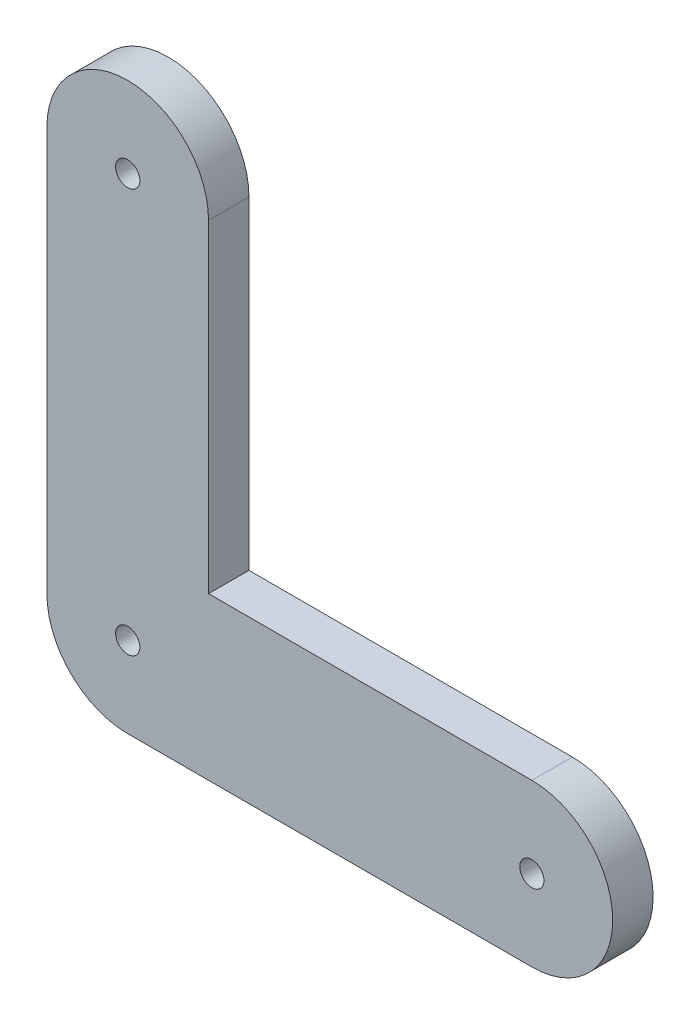
ISO-10303-21;
HEADER;
FILE_DESCRIPTION(('STEP AP214'),'2;1');
FILE_NAME('part.step','',(''),(''),'','','');
FILE_SCHEMA(('AUTOMOTIVE_DESIGN { 1 0 10303 214 1 1 1 1 }'));
ENDSEC;
DATA;
#1=APPLICATION_CONTEXT('core data for automotive mechanical design processes');
#2=APPLICATION_PROTOCOL_DEFINITION('international standard','automotive_design',2000,#1);
#3=PRODUCT_CONTEXT('',#1,'mechanical');
#4=PRODUCT('Part','Part','',(#3));
#5=PRODUCT_RELATED_PRODUCT_CATEGORY('part','',(#4));
#6=PRODUCT_DEFINITION_FORMATION('','',#4);
#7=PRODUCT_DEFINITION_CONTEXT('part definition',#1,'design');
#8=PRODUCT_DEFINITION('design','',#6,#7);
#9=PRODUCT_DEFINITION_SHAPE('','',#8);
#10=(LENGTH_UNIT() NAMED_UNIT(*) SI_UNIT(.MILLI.,.METRE.));
#11=(NAMED_UNIT(*) PLANE_ANGLE_UNIT() SI_UNIT($,.RADIAN.));
#12=(NAMED_UNIT(*) SI_UNIT($,.STERADIAN.) SOLID_ANGLE_UNIT());
#13=UNCERTAINTY_MEASURE_WITH_UNIT(LENGTH_MEASURE(1.E-05),#10,'distance_accuracy_value','');
#14=(GEOMETRIC_REPRESENTATION_CONTEXT(3) GLOBAL_UNCERTAINTY_ASSIGNED_CONTEXT((#13)) GLOBAL_UNIT_ASSIGNED_CONTEXT((#10,
#11,#12)) REPRESENTATION_CONTEXT('',''));
#15=CARTESIAN_POINT('',(0.,0.,0.));
#16=DIRECTION('',(0.,0.,1.));
#17=DIRECTION('',(1.,0.,0.));
#18=AXIS2_PLACEMENT_3D('',#15,#16,#17);
#19=CARTESIAN_POINT('',(50.,0.,5.));
#20=DIRECTION('',(0.,0.,1.));
#21=DIRECTION('',(1.,0.,0.));
#22=AXIS2_PLACEMENT_3D('',#19,#20,#21);
#23=PLANE('',#22);
#24=CARTESIAN_POINT('',(0.,50.,5.));
#25=DIRECTION('',(0.,0.,1.));
#26=DIRECTION('',(1.,0.,0.));
#27=AXIS2_PLACEMENT_3D('',#24,#25,#26);
#28=CIRCLE('',#27,1.5);
#29=CARTESIAN_POINT('',(1.5,50.,5.));
#30=VERTEX_POINT('',#29);
#31=EDGE_CURVE('E192',#30,#30,#28,.T.);
#32=ORIENTED_EDGE('',*,*,#31,.F.);
#33=EDGE_LOOP('',(#32));
#34=FACE_BOUND('',#33,.T.);
#35=DIRECTION('',(0.,1.,0.));
#36=VECTOR('',#35,1.);
#37=CARTESIAN_POINT('',(10.,50.,5.));
#38=LINE('',#37,#36);
#39=CARTESIAN_POINT('',(10.,10.,5.));
#40=VERTEX_POINT('',#39);
#41=CARTESIAN_POINT('',(10.,50.,5.));
#42=VERTEX_POINT('',#41);
#43=EDGE_CURVE('E155',#40,#42,#38,.T.);
#44=ORIENTED_EDGE('',*,*,#43,.T.);
#45=CARTESIAN_POINT('',(0.,50.,5.));
#46=DIRECTION('',(0.,0.,1.));
#47=DIRECTION('',(1.,0.,0.));
#48=AXIS2_PLACEMENT_3D('',#45,#46,#47);
#49=CIRCLE('',#48,10.);
#50=CARTESIAN_POINT('',(-10.,50.,5.));
#51=VERTEX_POINT('',#50);
#52=EDGE_CURVE('E97',#42,#51,#49,.T.);
#53=ORIENTED_EDGE('',*,*,#52,.T.);
#54=DIRECTION('',(0.,-1.,0.));
#55=VECTOR('',#54,1.);
#56=CARTESIAN_POINT('',(-10.,50.,5.));
#57=LINE('',#56,#55);
#58=CARTESIAN_POINT('',(-10.,0.,5.));
#59=VERTEX_POINT('',#58);
#60=EDGE_CURVE('E172',#51,#59,#57,.T.);
#61=ORIENTED_EDGE('',*,*,#60,.T.);
#62=CARTESIAN_POINT('',(0.,0.,5.));
#63=DIRECTION('',(0.,0.,1.));
#64=DIRECTION('',(1.,0.,0.));
#65=AXIS2_PLACEMENT_3D('',#62,#63,#64);
#66=CIRCLE('',#65,10.);
#67=CARTESIAN_POINT('',(0.,-10.,5.));
#68=VERTEX_POINT('',#67);
#69=EDGE_CURVE('E113',#59,#68,#66,.T.);
#70=ORIENTED_EDGE('',*,*,#69,.T.);
#71=DIRECTION('',(1.,0.,0.));
#72=VECTOR('',#71,1.);
#73=CARTESIAN_POINT('',(0.,-10.,5.));
#74=LINE('',#73,#72);
#75=CARTESIAN_POINT('',(50.,-10.,5.));
#76=VERTEX_POINT('',#75);
#77=EDGE_CURVE('E107',#68,#76,#74,.T.);
#78=ORIENTED_EDGE('',*,*,#77,.T.);
#79=CARTESIAN_POINT('',(50.,0.,5.));
#80=DIRECTION('',(0.,0.,1.));
#81=DIRECTION('',(1.,0.,0.));
#82=AXIS2_PLACEMENT_3D('',#79,#80,#81);
#83=CIRCLE('',#82,10.);
#84=CARTESIAN_POINT('',(50.,10.,5.));
#85=VERTEX_POINT('',#84);
#86=EDGE_CURVE('E111',#76,#85,#83,.T.);
#87=ORIENTED_EDGE('',*,*,#86,.T.);
#88=DIRECTION('',(-1.,0.,0.));
#89=VECTOR('',#88,1.);
#90=CARTESIAN_POINT('',(10.,10.,5.));
#91=LINE('',#90,#89);
#92=EDGE_CURVE('E57',#85,#40,#91,.T.);
#93=ORIENTED_EDGE('',*,*,#92,.T.);
#94=EDGE_LOOP('',(#44,#53,#61,#70,#78,#87,#93));
#95=FACE_BOUND('',#94,.T.);
#96=CARTESIAN_POINT('',(0.,0.,5.));
#97=DIRECTION('',(0.,0.,1.));
#98=DIRECTION('',(1.,0.,0.));
#99=AXIS2_PLACEMENT_3D('',#96,#97,#98);
#100=CIRCLE('',#99,1.5);
#101=CARTESIAN_POINT('',(1.5,0.,5.));
#102=VERTEX_POINT('',#101);
#103=EDGE_CURVE('E140',#102,#102,#100,.T.);
#104=ORIENTED_EDGE('',*,*,#103,.F.);
#105=EDGE_LOOP('',(#104));
#106=FACE_BOUND('',#105,.T.);
#107=CARTESIAN_POINT('',(50.,0.,5.));
#108=DIRECTION('',(0.,0.,1.));
#109=DIRECTION('',(1.,0.,0.));
#110=AXIS2_PLACEMENT_3D('',#107,#108,#109);
#111=CIRCLE('',#110,1.5);
#112=CARTESIAN_POINT('',(51.5,0.,5.));
#113=VERTEX_POINT('',#112);
#114=EDGE_CURVE('E200',#113,#113,#111,.T.);
#115=ORIENTED_EDGE('',*,*,#114,.F.);
#116=EDGE_LOOP('',(#115));
#117=FACE_BOUND('',#116,.T.);
#118=ADVANCED_FACE('F39',(#34,#95,#106,#117),#23,.T.);
#119=CARTESIAN_POINT('',(50.,0.,0.));
#120=DIRECTION('',(0.,0.,1.));
#121=DIRECTION('',(1.,0.,0.));
#122=AXIS2_PLACEMENT_3D('',#119,#120,#121);
#123=PLANE('',#122);
#124=DIRECTION('',(0.,1.,0.));
#125=VECTOR('',#124,1.);
#126=CARTESIAN_POINT('',(10.,50.,0.));
#127=LINE('',#126,#125);
#128=CARTESIAN_POINT('',(10.,10.,0.));
#129=VERTEX_POINT('',#128);
#130=CARTESIAN_POINT('',(10.,50.,0.));
#131=VERTEX_POINT('',#130);
#132=EDGE_CURVE('E135',#129,#131,#127,.T.);
#133=ORIENTED_EDGE('',*,*,#132,.F.);
#134=DIRECTION('',(-1.,0.,0.));
#135=VECTOR('',#134,1.);
#136=CARTESIAN_POINT('',(10.,10.,0.));
#137=LINE('',#136,#135);
#138=CARTESIAN_POINT('',(50.,10.,0.));
#139=VERTEX_POINT('',#138);
#140=EDGE_CURVE('E89',#139,#129,#137,.T.);
#141=ORIENTED_EDGE('',*,*,#140,.F.);
#142=CARTESIAN_POINT('',(50.,0.,0.));
#143=DIRECTION('',(0.,0.,1.));
#144=DIRECTION('',(1.,0.,0.));
#145=AXIS2_PLACEMENT_3D('',#142,#143,#144);
#146=CIRCLE('',#145,10.);
#147=CARTESIAN_POINT('',(50.,-10.,0.));
#148=VERTEX_POINT('',#147);
#149=EDGE_CURVE('E83',#148,#139,#146,.T.);
#150=ORIENTED_EDGE('',*,*,#149,.F.);
#151=DIRECTION('',(1.,0.,0.));
#152=VECTOR('',#151,1.);
#153=CARTESIAN_POINT('',(0.,-10.,0.));
#154=LINE('',#153,#152);
#155=CARTESIAN_POINT('',(0.,-10.,0.));
#156=VERTEX_POINT('',#155);
#157=EDGE_CURVE('E122',#156,#148,#154,.T.);
#158=ORIENTED_EDGE('',*,*,#157,.F.);
#159=CARTESIAN_POINT('',(0.,0.,0.));
#160=DIRECTION('',(0.,0.,1.));
#161=DIRECTION('',(1.,0.,0.));
#162=AXIS2_PLACEMENT_3D('',#159,#160,#161);
#163=CIRCLE('',#162,10.);
#164=CARTESIAN_POINT('',(-10.,0.,0.));
#165=VERTEX_POINT('',#164);
#166=EDGE_CURVE('E146',#165,#156,#163,.T.);
#167=ORIENTED_EDGE('',*,*,#166,.F.);
#168=DIRECTION('',(0.,-1.,0.));
#169=VECTOR('',#168,1.);
#170=CARTESIAN_POINT('',(-10.,50.,0.));
#171=LINE('',#170,#169);
#172=CARTESIAN_POINT('',(-10.,50.,0.));
#173=VERTEX_POINT('',#172);
#174=EDGE_CURVE('E143',#173,#165,#171,.T.);
#175=ORIENTED_EDGE('',*,*,#174,.F.);
#176=CARTESIAN_POINT('',(0.,50.,0.));
#177=DIRECTION('',(0.,0.,1.));
#178=DIRECTION('',(1.,0.,0.));
#179=AXIS2_PLACEMENT_3D('',#176,#177,#178);
#180=CIRCLE('',#179,10.);
#181=EDGE_CURVE('E139',#131,#173,#180,.T.);
#182=ORIENTED_EDGE('',*,*,#181,.F.);
#183=EDGE_LOOP('',(#133,#141,#150,#158,#167,#175,#182));
#184=FACE_BOUND('',#183,.T.);
#185=CARTESIAN_POINT('',(0.,0.,0.));
#186=DIRECTION('',(0.,0.,1.));
#187=DIRECTION('',(1.,0.,0.));
#188=AXIS2_PLACEMENT_3D('',#185,#186,#187);
#189=CIRCLE('',#188,1.5);
#190=CARTESIAN_POINT('',(1.5,0.,0.));
#191=VERTEX_POINT('',#190);
#192=EDGE_CURVE('E188',#191,#191,#189,.T.);
#193=ORIENTED_EDGE('',*,*,#192,.T.);
#194=EDGE_LOOP('',(#193));
#195=FACE_BOUND('',#194,.T.);
#196=CARTESIAN_POINT('',(0.,50.,0.));
#197=DIRECTION('',(0.,0.,1.));
#198=DIRECTION('',(1.,0.,0.));
#199=AXIS2_PLACEMENT_3D('',#196,#197,#198);
#200=CIRCLE('',#199,1.5);
#201=CARTESIAN_POINT('',(1.5,50.,0.));
#202=VERTEX_POINT('',#201);
#203=EDGE_CURVE('E196',#202,#202,#200,.T.);
#204=ORIENTED_EDGE('',*,*,#203,.T.);
#205=EDGE_LOOP('',(#204));
#206=FACE_BOUND('',#205,.T.);
#207=CARTESIAN_POINT('',(50.,0.,0.));
#208=DIRECTION('',(0.,0.,1.));
#209=DIRECTION('',(1.,0.,0.));
#210=AXIS2_PLACEMENT_3D('',#207,#208,#209);
#211=CIRCLE('',#210,1.5);
#212=CARTESIAN_POINT('',(51.5,0.,0.));
#213=VERTEX_POINT('',#212);
#214=EDGE_CURVE('E204',#213,#213,#211,.T.);
#215=ORIENTED_EDGE('',*,*,#214,.T.);
#216=EDGE_LOOP('',(#215));
#217=FACE_BOUND('',#216,.T.);
#218=ADVANCED_FACE('F176',(#184,#195,#206,#217),#123,.F.);
#219=CARTESIAN_POINT('',(10.,50.,5.));
#220=DIRECTION('',(-1.,0.,0.));
#221=DIRECTION('',(0.,-1.,0.));
#222=AXIS2_PLACEMENT_3D('',#219,#220,#221);
#223=PLANE('',#222);
#224=ORIENTED_EDGE('',*,*,#132,.T.);
#225=DIRECTION('',(0.,0.,-1.));
#226=VECTOR('',#225,1.);
#227=CARTESIAN_POINT('',(10.,50.,5.));
#228=LINE('',#227,#226);
#229=EDGE_CURVE('E11',#42,#131,#228,.T.);
#230=ORIENTED_EDGE('',*,*,#229,.F.);
#231=ORIENTED_EDGE('',*,*,#43,.F.);
#232=DIRECTION('',(0.,0.,-1.));
#233=VECTOR('',#232,1.);
#234=CARTESIAN_POINT('',(10.,10.,5.));
#235=LINE('',#234,#233);
#236=EDGE_CURVE('E131',#40,#129,#235,.T.);
#237=ORIENTED_EDGE('',*,*,#236,.T.);
#238=EDGE_LOOP('',(#224,#230,#231,#237));
#239=FACE_BOUND('',#238,.T.);
#240=ADVANCED_FACE('F41',(#239),#223,.F.);
#241=CARTESIAN_POINT('',(0.,50.,5.));
#242=DIRECTION('',(0.,0.,-1.));
#243=DIRECTION('',(-1.,0.,0.));
#244=AXIS2_PLACEMENT_3D('',#241,#242,#243);
#245=CYLINDRICAL_SURFACE('',#244,10.);
#246=ORIENTED_EDGE('',*,*,#181,.T.);
#247=DIRECTION('',(0.,0.,-1.));
#248=VECTOR('',#247,1.);
#249=CARTESIAN_POINT('',(-10.,50.,5.));
#250=LINE('',#249,#248);
#251=EDGE_CURVE('E49',#51,#173,#250,.T.);
#252=ORIENTED_EDGE('',*,*,#251,.F.);
#253=ORIENTED_EDGE('',*,*,#52,.F.);
#254=ORIENTED_EDGE('',*,*,#229,.T.);
#255=EDGE_LOOP('',(#246,#252,#253,#254));
#256=FACE_BOUND('',#255,.T.);
#257=ADVANCED_FACE('F237',(#256),#245,.T.);
#258=CARTESIAN_POINT('',(-10.,50.,5.));
#259=DIRECTION('',(1.,0.,0.));
#260=DIRECTION('',(0.,1.,0.));
#261=AXIS2_PLACEMENT_3D('',#258,#259,#260);
#262=PLANE('',#261);
#263=ORIENTED_EDGE('',*,*,#174,.T.);
#264=DIRECTION('',(0.,0.,-1.));
#265=VECTOR('',#264,1.);
#266=CARTESIAN_POINT('',(-10.,0.,5.));
#267=LINE('',#266,#265);
#268=EDGE_CURVE('E162',#59,#165,#267,.T.);
#269=ORIENTED_EDGE('',*,*,#268,.F.);
#270=ORIENTED_EDGE('',*,*,#60,.F.);
#271=ORIENTED_EDGE('',*,*,#251,.T.);
#272=EDGE_LOOP('',(#263,#269,#270,#271));
#273=FACE_BOUND('',#272,.T.);
#274=ADVANCED_FACE('F170',(#273),#262,.F.);
#275=CARTESIAN_POINT('',(0.,0.,5.));
#276=DIRECTION('',(0.,0.,-1.));
#277=DIRECTION('',(-1.,0.,0.));
#278=AXIS2_PLACEMENT_3D('',#275,#276,#277);
#279=CYLINDRICAL_SURFACE('',#278,10.);
#280=ORIENTED_EDGE('',*,*,#166,.T.);
#281=DIRECTION('',(0.,0.,-1.));
#282=VECTOR('',#281,1.);
#283=CARTESIAN_POINT('',(0.,-10.,5.));
#284=LINE('',#283,#282);
#285=EDGE_CURVE('E124',#68,#156,#284,.T.);
#286=ORIENTED_EDGE('',*,*,#285,.F.);
#287=ORIENTED_EDGE('',*,*,#69,.F.);
#288=ORIENTED_EDGE('',*,*,#268,.T.);
#289=EDGE_LOOP('',(#280,#286,#287,#288));
#290=FACE_BOUND('',#289,.T.);
#291=ADVANCED_FACE('F179',(#290),#279,.T.);
#292=CARTESIAN_POINT('',(0.,-10.,5.));
#293=DIRECTION('',(0.,1.,0.));
#294=DIRECTION('',(0.,0.,1.));
#295=AXIS2_PLACEMENT_3D('',#292,#293,#294);
#296=PLANE('',#295);
#297=ORIENTED_EDGE('',*,*,#157,.T.);
#298=DIRECTION('',(0.,0.,-1.));
#299=VECTOR('',#298,1.);
#300=CARTESIAN_POINT('',(50.,-10.,5.));
#301=LINE('',#300,#299);
#302=EDGE_CURVE('E119',#76,#148,#301,.T.);
#303=ORIENTED_EDGE('',*,*,#302,.F.);
#304=ORIENTED_EDGE('',*,*,#77,.F.);
#305=ORIENTED_EDGE('',*,*,#285,.T.);
#306=EDGE_LOOP('',(#297,#303,#304,#305));
#307=FACE_BOUND('',#306,.T.);
#308=ADVANCED_FACE('F120',(#307),#296,.F.);
#309=CARTESIAN_POINT('',(50.,0.,5.));
#310=DIRECTION('',(0.,0.,-1.));
#311=DIRECTION('',(-1.,0.,0.));
#312=AXIS2_PLACEMENT_3D('',#309,#310,#311);
#313=CYLINDRICAL_SURFACE('',#312,10.);
#314=ORIENTED_EDGE('',*,*,#149,.T.);
#315=DIRECTION('',(0.,0.,-1.));
#316=VECTOR('',#315,1.);
#317=CARTESIAN_POINT('',(50.,10.,5.));
#318=LINE('',#317,#316);
#319=EDGE_CURVE('E125',#85,#139,#318,.T.);
#320=ORIENTED_EDGE('',*,*,#319,.F.);
#321=ORIENTED_EDGE('',*,*,#86,.F.);
#322=ORIENTED_EDGE('',*,*,#302,.T.);
#323=EDGE_LOOP('',(#314,#320,#321,#322));
#324=FACE_BOUND('',#323,.T.);
#325=ADVANCED_FACE('F127',(#324),#313,.T.);
#326=CARTESIAN_POINT('',(10.,10.,5.));
#327=DIRECTION('',(0.,-1.,0.));
#328=DIRECTION('',(1.,0.,0.));
#329=AXIS2_PLACEMENT_3D('',#326,#327,#328);
#330=PLANE('',#329);
#331=ORIENTED_EDGE('',*,*,#140,.T.);
#332=ORIENTED_EDGE('',*,*,#236,.F.);
#333=ORIENTED_EDGE('',*,*,#92,.F.);
#334=ORIENTED_EDGE('',*,*,#319,.T.);
#335=EDGE_LOOP('',(#331,#332,#333,#334));
#336=FACE_BOUND('',#335,.T.);
#337=ADVANCED_FACE('F227',(#336),#330,.F.);
#338=CARTESIAN_POINT('',(0.,0.,5.));
#339=DIRECTION('',(0.,0.,-1.));
#340=DIRECTION('',(-1.,0.,0.));
#341=AXIS2_PLACEMENT_3D('',#338,#339,#340);
#342=CYLINDRICAL_SURFACE('',#341,1.5);
#343=ORIENTED_EDGE('',*,*,#103,.T.);
#344=EDGE_LOOP('',(#343));
#345=FACE_BOUND('',#344,.T.);
#346=ORIENTED_EDGE('',*,*,#192,.F.);
#347=EDGE_LOOP('',(#346));
#348=FACE_BOUND('',#347,.T.);
#349=ADVANCED_FACE('F224',(#345,#348),#342,.F.);
#350=CARTESIAN_POINT('',(0.,50.,5.));
#351=DIRECTION('',(0.,0.,-1.));
#352=DIRECTION('',(-1.,0.,0.));
#353=AXIS2_PLACEMENT_3D('',#350,#351,#352);
#354=CYLINDRICAL_SURFACE('',#353,1.5);
#355=ORIENTED_EDGE('',*,*,#31,.T.);
#356=EDGE_LOOP('',(#355));
#357=FACE_BOUND('',#356,.T.);
#358=ORIENTED_EDGE('',*,*,#203,.F.);
#359=EDGE_LOOP('',(#358));
#360=FACE_BOUND('',#359,.T.);
#361=ADVANCED_FACE('F296',(#357,#360),#354,.F.);
#362=CARTESIAN_POINT('',(50.,0.,5.));
#363=DIRECTION('',(0.,0.,-1.));
#364=DIRECTION('',(-1.,0.,0.));
#365=AXIS2_PLACEMENT_3D('',#362,#363,#364);
#366=CYLINDRICAL_SURFACE('',#365,1.5);
#367=ORIENTED_EDGE('',*,*,#114,.T.);
#368=EDGE_LOOP('',(#367));
#369=FACE_BOUND('',#368,.T.);
#370=ORIENTED_EDGE('',*,*,#214,.F.);
#371=EDGE_LOOP('',(#370));
#372=FACE_BOUND('',#371,.T.);
#373=ADVANCED_FACE('F212',(#369,#372),#366,.F.);
#374=CLOSED_SHELL('',(#118,#218,#240,#257,#274,#291,#308,#325,#337,#349,#361,#373));
#375=MANIFOLD_SOLID_BREP('B2',#374);
#376=ADVANCED_BREP_SHAPE_REPRESENTATION('',(#18,#375),#14);
#377=SHAPE_DEFINITION_REPRESENTATION(#9,#376);
ENDSEC;
END-ISO-10303-21;
